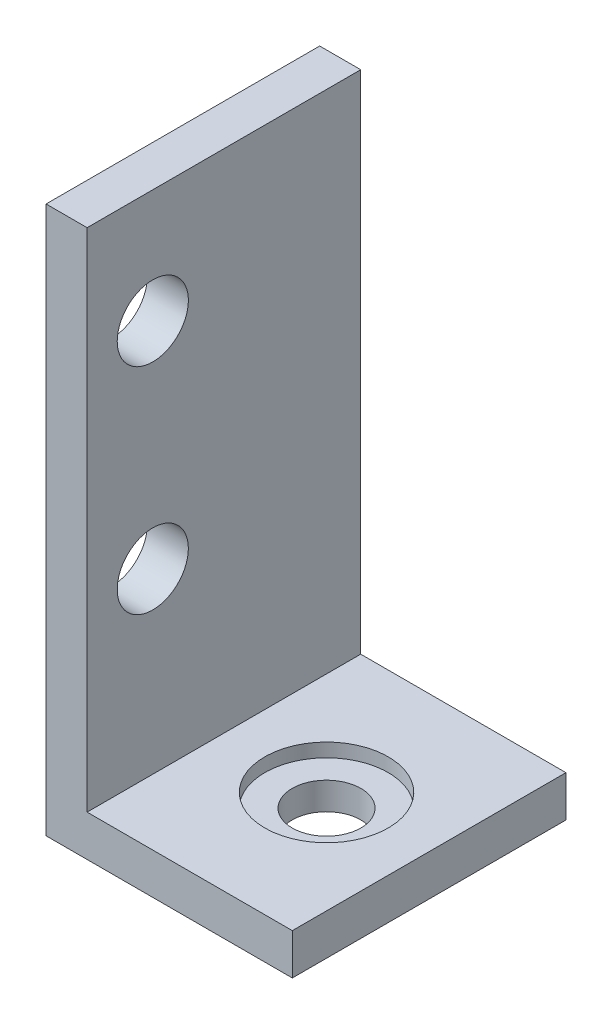
ISO-10303-21;
HEADER;
FILE_DESCRIPTION(('STEP AP214'),'2;1');
FILE_NAME('part.step','',(''),(''),'','','');
FILE_SCHEMA(('AUTOMOTIVE_DESIGN { 1 0 10303 214 1 1 1 1 }'));
ENDSEC;
DATA;
#1=APPLICATION_CONTEXT('core data for automotive mechanical design processes');
#2=APPLICATION_PROTOCOL_DEFINITION('international standard','automotive_design',2000,#1);
#3=PRODUCT_CONTEXT('',#1,'mechanical');
#4=PRODUCT('Part','Part','',(#3));
#5=PRODUCT_RELATED_PRODUCT_CATEGORY('part','',(#4));
#6=PRODUCT_DEFINITION_FORMATION('','',#4);
#7=PRODUCT_DEFINITION_CONTEXT('part definition',#1,'design');
#8=PRODUCT_DEFINITION('design','',#6,#7);
#9=PRODUCT_DEFINITION_SHAPE('','',#8);
#10=(LENGTH_UNIT() NAMED_UNIT(*) SI_UNIT(.MILLI.,.METRE.));
#11=(NAMED_UNIT(*) PLANE_ANGLE_UNIT() SI_UNIT($,.RADIAN.));
#12=(NAMED_UNIT(*) SI_UNIT($,.STERADIAN.) SOLID_ANGLE_UNIT());
#13=UNCERTAINTY_MEASURE_WITH_UNIT(LENGTH_MEASURE(1.E-05),#10,'distance_accuracy_value','');
#14=(GEOMETRIC_REPRESENTATION_CONTEXT(3) GLOBAL_UNCERTAINTY_ASSIGNED_CONTEXT((#13)) GLOBAL_UNIT_ASSIGNED_CONTEXT((#10,
#11,#12)) REPRESENTATION_CONTEXT('',''));
#15=CARTESIAN_POINT('',(0.,0.,0.));
#16=DIRECTION('',(0.,0.,1.));
#17=DIRECTION('',(1.,0.,0.));
#18=AXIS2_PLACEMENT_3D('',#15,#16,#17);
#19=CARTESIAN_POINT('',(30.6258807045637,3.,-9.11509707766213));
#20=DIRECTION('',(0.,0.,-1.));
#21=DIRECTION('',(-1.,0.,0.));
#22=AXIS2_PLACEMENT_3D('',#19,#20,#21);
#23=PLANE('',#22);
#24=DIRECTION('',(0.,1.,0.));
#25=VECTOR('',#24,1.);
#26=CARTESIAN_POINT('',(15.6258807045637,0.,-9.11509707766213));
#27=LINE('',#26,#25);
#28=CARTESIAN_POINT('',(15.6258807045637,3.,-9.11509707766213));
#29=VERTEX_POINT('',#28);
#30=CARTESIAN_POINT('',(15.6258807045636,40.,-9.11509707766213));
#31=VERTEX_POINT('',#30);
#32=EDGE_CURVE('E50',#29,#31,#27,.T.);
#33=ORIENTED_EDGE('',*,*,#32,.T.);
#34=DIRECTION('',(-1.,0.,0.));
#35=VECTOR('',#34,1.);
#36=CARTESIAN_POINT('',(15.6258807045636,40.,-9.11509707766213));
#37=LINE('',#36,#35);
#38=CARTESIAN_POINT('',(12.6258807045636,40.,-9.11509707766213));
#39=VERTEX_POINT('',#38);
#40=EDGE_CURVE('E127',#31,#39,#37,.T.);
#41=ORIENTED_EDGE('',*,*,#40,.T.);
#42=DIRECTION('',(0.,1.,0.));
#43=VECTOR('',#42,1.);
#44=CARTESIAN_POINT('',(12.6258807045636,0.,-9.11509707766213));
#45=LINE('',#44,#43);
#46=CARTESIAN_POINT('',(12.6258807045636,0.,-9.11509707766213));
#47=VERTEX_POINT('',#46);
#48=EDGE_CURVE('E96',#47,#39,#45,.T.);
#49=ORIENTED_EDGE('',*,*,#48,.F.);
#50=DIRECTION('',(1.,0.,0.));
#51=VECTOR('',#50,1.);
#52=CARTESIAN_POINT('',(30.6258807045637,0.,-9.11509707766213));
#53=LINE('',#52,#51);
#54=CARTESIAN_POINT('',(30.6258807045637,0.,-9.11509707766213));
#55=VERTEX_POINT('',#54);
#56=EDGE_CURVE('E93',#47,#55,#53,.T.);
#57=ORIENTED_EDGE('',*,*,#56,.T.);
#58=DIRECTION('',(0.,-1.,0.));
#59=VECTOR('',#58,1.);
#60=CARTESIAN_POINT('',(30.6258807045637,3.,-9.11509707766213));
#61=LINE('',#60,#59);
#62=CARTESIAN_POINT('',(30.6258807045637,3.,-9.11509707766213));
#63=VERTEX_POINT('',#62);
#64=EDGE_CURVE('E11',#63,#55,#61,.T.);
#65=ORIENTED_EDGE('',*,*,#64,.F.);
#66=DIRECTION('',(1.,0.,0.));
#67=VECTOR('',#66,1.);
#68=CARTESIAN_POINT('',(30.6258807045637,3.,-9.11509707766213));
#69=LINE('',#68,#67);
#70=EDGE_CURVE('E85',#29,#63,#69,.T.);
#71=ORIENTED_EDGE('',*,*,#70,.F.);
#72=EDGE_LOOP('',(#33,#41,#49,#57,#65,#71));
#73=FACE_BOUND('',#72,.T.);
#74=ADVANCED_FACE('F33',(#73),#23,.F.);
#75=CARTESIAN_POINT('',(15.6258807045636,3.,-29.1150970776621));
#76=DIRECTION('',(0.,0.,1.));
#77=DIRECTION('',(1.,0.,0.));
#78=AXIS2_PLACEMENT_3D('',#75,#76,#77);
#79=PLANE('',#78);
#80=DIRECTION('',(0.,1.,0.));
#81=VECTOR('',#80,1.);
#82=CARTESIAN_POINT('',(12.6258807045636,0.,-29.1150970776621));
#83=LINE('',#82,#81);
#84=CARTESIAN_POINT('',(12.6258807045636,0.,-29.1150970776621));
#85=VERTEX_POINT('',#84);
#86=CARTESIAN_POINT('',(12.6258807045636,40.,-29.1150970776622));
#87=VERTEX_POINT('',#86);
#88=EDGE_CURVE('E118',#85,#87,#83,.T.);
#89=ORIENTED_EDGE('',*,*,#88,.T.);
#90=DIRECTION('',(-1.,0.,0.));
#91=VECTOR('',#90,1.);
#92=CARTESIAN_POINT('',(15.6258807045636,40.,-29.1150970776622));
#93=LINE('',#92,#91);
#94=CARTESIAN_POINT('',(15.6258807045636,40.,-29.1150970776622));
#95=VERTEX_POINT('',#94);
#96=EDGE_CURVE('E126',#95,#87,#93,.T.);
#97=ORIENTED_EDGE('',*,*,#96,.F.);
#98=DIRECTION('',(0.,1.,0.));
#99=VECTOR('',#98,1.);
#100=CARTESIAN_POINT('',(15.6258807045636,0.,-29.1150970776621));
#101=LINE('',#100,#99);
#102=CARTESIAN_POINT('',(15.6258807045636,3.,-29.1150970776621));
#103=VERTEX_POINT('',#102);
#104=EDGE_CURVE('E115',#103,#95,#101,.T.);
#105=ORIENTED_EDGE('',*,*,#104,.F.);
#106=DIRECTION('',(-1.,0.,0.));
#107=VECTOR('',#106,1.);
#108=CARTESIAN_POINT('',(15.6258807045636,3.,-29.1150970776621));
#109=LINE('',#108,#107);
#110=CARTESIAN_POINT('',(30.6258807045637,3.,-29.1150970776621));
#111=VERTEX_POINT('',#110);
#112=EDGE_CURVE('E84',#111,#103,#109,.T.);
#113=ORIENTED_EDGE('',*,*,#112,.F.);
#114=DIRECTION('',(0.,-1.,0.));
#115=VECTOR('',#114,1.);
#116=CARTESIAN_POINT('',(30.6258807045637,3.,-29.1150970776621));
#117=LINE('',#116,#115);
#118=CARTESIAN_POINT('',(30.6258807045637,0.,-29.1150970776621));
#119=VERTEX_POINT('',#118);
#120=EDGE_CURVE('E42',#111,#119,#117,.T.);
#121=ORIENTED_EDGE('',*,*,#120,.T.);
#122=DIRECTION('',(-1.,0.,0.));
#123=VECTOR('',#122,1.);
#124=CARTESIAN_POINT('',(15.6258807045636,0.,-29.1150970776621));
#125=LINE('',#124,#123);
#126=EDGE_CURVE('E90',#119,#85,#125,.T.);
#127=ORIENTED_EDGE('',*,*,#126,.T.);
#128=EDGE_LOOP('',(#89,#97,#105,#113,#121,#127));
#129=FACE_BOUND('',#128,.T.);
#130=ADVANCED_FACE('F179',(#129),#79,.F.);
#131=CARTESIAN_POINT('',(15.6258807045636,0.,-29.1150970776621));
#132=DIRECTION('',(1.,0.,0.));
#133=DIRECTION('',(0.,0.,-1.));
#134=AXIS2_PLACEMENT_3D('',#131,#132,#133);
#135=PLANE('',#134);
#136=CARTESIAN_POINT('',(15.6258807045636,31.7,-13.9150970776621));
#137=DIRECTION('',(-1.,0.,0.));
#138=DIRECTION('',(0.,0.,1.));
#139=AXIS2_PLACEMENT_3D('',#136,#137,#138);
#140=CIRCLE('',#139,2.6);
#141=CARTESIAN_POINT('',(15.6258807045636,31.7,-11.3150970776621));
#142=VERTEX_POINT('',#141);
#143=EDGE_CURVE('E141',#142,#142,#140,.T.);
#144=ORIENTED_EDGE('',*,*,#143,.T.);
#145=EDGE_LOOP('',(#144));
#146=FACE_BOUND('',#145,.T.);
#147=CARTESIAN_POINT('',(15.6258807045636,16.,-13.9150970776621));
#148=DIRECTION('',(1.,0.,0.));
#149=DIRECTION('',(0.,0.,-1.));
#150=AXIS2_PLACEMENT_3D('',#147,#148,#149);
#151=CIRCLE('',#150,2.6);
#152=CARTESIAN_POINT('',(15.6258807045636,16.,-16.5150970776621));
#153=VERTEX_POINT('',#152);
#154=EDGE_CURVE('E138',#153,#153,#151,.T.);
#155=ORIENTED_EDGE('',*,*,#154,.F.);
#156=EDGE_LOOP('',(#155));
#157=FACE_BOUND('',#156,.T.);
#158=ORIENTED_EDGE('',*,*,#104,.T.);
#159=DIRECTION('',(0.,0.,-1.));
#160=VECTOR('',#159,1.);
#161=CARTESIAN_POINT('',(15.6258807045636,40.,-29.1150970776622));
#162=LINE('',#161,#160);
#163=EDGE_CURVE('E129',#31,#95,#162,.T.);
#164=ORIENTED_EDGE('',*,*,#163,.F.);
#165=ORIENTED_EDGE('',*,*,#32,.F.);
#166=DIRECTION('',(0.,0.,1.));
#167=VECTOR('',#166,1.);
#168=CARTESIAN_POINT('',(15.6258807045637,3.,-9.11509707766213));
#169=LINE('',#168,#167);
#170=EDGE_CURVE('E67',#103,#29,#169,.T.);
#171=ORIENTED_EDGE('',*,*,#170,.F.);
#172=EDGE_LOOP('',(#158,#164,#165,#171));
#173=FACE_BOUND('',#172,.T.);
#174=ADVANCED_FACE('F150',(#146,#157,#173),#135,.T.);
#175=CARTESIAN_POINT('',(12.6258807045636,0.,-29.1150970776621));
#176=DIRECTION('',(-1.,0.,0.));
#177=DIRECTION('',(0.,0.,1.));
#178=AXIS2_PLACEMENT_3D('',#175,#176,#177);
#179=PLANE('',#178);
#180=CARTESIAN_POINT('',(12.6258807045636,31.7,-13.9150970776621));
#181=DIRECTION('',(-1.,0.,0.));
#182=DIRECTION('',(0.,0.,1.));
#183=AXIS2_PLACEMENT_3D('',#180,#181,#182);
#184=CIRCLE('',#183,2.6);
#185=CARTESIAN_POINT('',(12.6258807045636,31.7,-11.3150970776621));
#186=VERTEX_POINT('',#185);
#187=EDGE_CURVE('E144',#186,#186,#184,.T.);
#188=ORIENTED_EDGE('',*,*,#187,.F.);
#189=EDGE_LOOP('',(#188));
#190=FACE_BOUND('',#189,.T.);
#191=CARTESIAN_POINT('',(12.6258807045636,16.,-13.9150970776621));
#192=DIRECTION('',(1.,0.,0.));
#193=DIRECTION('',(0.,0.,-1.));
#194=AXIS2_PLACEMENT_3D('',#191,#192,#193);
#195=CIRCLE('',#194,2.6);
#196=CARTESIAN_POINT('',(12.6258807045636,16.,-16.5150970776621));
#197=VERTEX_POINT('',#196);
#198=EDGE_CURVE('E135',#197,#197,#195,.T.);
#199=ORIENTED_EDGE('',*,*,#198,.T.);
#200=EDGE_LOOP('',(#199));
#201=FACE_BOUND('',#200,.T.);
#202=ORIENTED_EDGE('',*,*,#48,.T.);
#203=DIRECTION('',(0.,0.,-1.));
#204=VECTOR('',#203,1.);
#205=CARTESIAN_POINT('',(12.6258807045636,40.,-29.1150970776622));
#206=LINE('',#205,#204);
#207=EDGE_CURVE('E132',#39,#87,#206,.T.);
#208=ORIENTED_EDGE('',*,*,#207,.T.);
#209=ORIENTED_EDGE('',*,*,#88,.F.);
#210=DIRECTION('',(0.,0.,1.));
#211=VECTOR('',#210,1.);
#212=CARTESIAN_POINT('',(12.6258807045636,0.,-29.1150970776621));
#213=LINE('',#212,#211);
#214=EDGE_CURVE('E121',#85,#47,#213,.T.);
#215=ORIENTED_EDGE('',*,*,#214,.T.);
#216=EDGE_LOOP('',(#202,#208,#209,#215));
#217=FACE_BOUND('',#216,.T.);
#218=ADVANCED_FACE('F160',(#190,#201,#217),#179,.T.);
#219=CARTESIAN_POINT('',(23.1258807045636,3.,-19.1150970776621));
#220=DIRECTION('',(0.,-1.,0.));
#221=DIRECTION('',(0.,0.,-1.));
#222=AXIS2_PLACEMENT_3D('',#219,#220,#221);
#223=CYLINDRICAL_SURFACE('',#222,2.51);
#224=CARTESIAN_POINT('',(23.1258807045636,0.,-19.1150970776621));
#225=DIRECTION('',(0.,1.,0.));
#226=DIRECTION('',(0.,0.,1.));
#227=AXIS2_PLACEMENT_3D('',#224,#225,#226);
#228=CIRCLE('',#227,2.51);
#229=CARTESIAN_POINT('',(23.1258807045636,0.,-16.6050970776621));
#230=VERTEX_POINT('',#229);
#231=EDGE_CURVE('E99',#230,#230,#228,.T.);
#232=ORIENTED_EDGE('',*,*,#231,.F.);
#233=EDGE_LOOP('',(#232));
#234=FACE_BOUND('',#233,.T.);
#235=CARTESIAN_POINT('',(23.1258807045636,2.,-19.1150970776621));
#236=DIRECTION('',(0.,1.,0.));
#237=DIRECTION('',(0.,0.,1.));
#238=AXIS2_PLACEMENT_3D('',#235,#236,#237);
#239=CIRCLE('',#238,2.51);
#240=CARTESIAN_POINT('',(23.1258807045636,2.,-16.6050970776621));
#241=VERTEX_POINT('',#240);
#242=EDGE_CURVE('E36',#241,#241,#239,.T.);
#243=ORIENTED_EDGE('',*,*,#242,.T.);
#244=EDGE_LOOP('',(#243));
#245=FACE_BOUND('',#244,.T.);
#246=ADVANCED_FACE('F163',(#234,#245),#223,.F.);
#247=CARTESIAN_POINT('',(0.,3.,0.));
#248=DIRECTION('',(0.,-1.,0.));
#249=DIRECTION('',(0.,0.,-1.));
#250=AXIS2_PLACEMENT_3D('',#247,#248,#249);
#251=PLANE('',#250);
#252=CARTESIAN_POINT('',(23.1258807045636,3.,-19.1150970776621));
#253=DIRECTION('',(0.,1.,0.));
#254=DIRECTION('',(0.,0.,1.));
#255=AXIS2_PLACEMENT_3D('',#252,#253,#254);
#256=CIRCLE('',#255,4.51);
#257=CARTESIAN_POINT('',(23.1258807045636,3.,-14.6050970776621));
#258=VERTEX_POINT('',#257);
#259=EDGE_CURVE('E111',#258,#258,#256,.T.);
#260=ORIENTED_EDGE('',*,*,#259,.F.);
#261=EDGE_LOOP('',(#260));
#262=FACE_BOUND('',#261,.T.);
#263=ORIENTED_EDGE('',*,*,#70,.T.);
#264=DIRECTION('',(0.,0.,-1.));
#265=VECTOR('',#264,1.);
#266=CARTESIAN_POINT('',(30.6258807045637,3.,-9.11509707766213));
#267=LINE('',#266,#265);
#268=EDGE_CURVE('E75',#63,#111,#267,.T.);
#269=ORIENTED_EDGE('',*,*,#268,.T.);
#270=ORIENTED_EDGE('',*,*,#112,.T.);
#271=ORIENTED_EDGE('',*,*,#170,.T.);
#272=EDGE_LOOP('',(#263,#269,#270,#271));
#273=FACE_BOUND('',#272,.T.);
#274=ADVANCED_FACE('F88',(#262,#273),#251,.F.);
#275=CARTESIAN_POINT('',(0.,0.,0.));
#276=DIRECTION('',(0.,-1.,0.));
#277=DIRECTION('',(0.,0.,-1.));
#278=AXIS2_PLACEMENT_3D('',#275,#276,#277);
#279=PLANE('',#278);
#280=ORIENTED_EDGE('',*,*,#56,.F.);
#281=ORIENTED_EDGE('',*,*,#214,.F.);
#282=ORIENTED_EDGE('',*,*,#126,.F.);
#283=DIRECTION('',(0.,0.,-1.));
#284=VECTOR('',#283,1.);
#285=CARTESIAN_POINT('',(30.6258807045637,0.,-9.11509707766213));
#286=LINE('',#285,#284);
#287=EDGE_CURVE('E63',#55,#119,#286,.T.);
#288=ORIENTED_EDGE('',*,*,#287,.F.);
#289=EDGE_LOOP('',(#280,#281,#282,#288));
#290=FACE_BOUND('',#289,.T.);
#291=ORIENTED_EDGE('',*,*,#231,.T.);
#292=EDGE_LOOP('',(#291));
#293=FACE_BOUND('',#292,.T.);
#294=ADVANCED_FACE('F182',(#290,#293),#279,.T.);
#295=CARTESIAN_POINT('',(30.6258807045637,3.,-9.11509707766213));
#296=DIRECTION('',(-1.,0.,0.));
#297=DIRECTION('',(0.,0.,1.));
#298=AXIS2_PLACEMENT_3D('',#295,#296,#297);
#299=PLANE('',#298);
#300=ORIENTED_EDGE('',*,*,#287,.T.);
#301=ORIENTED_EDGE('',*,*,#120,.F.);
#302=ORIENTED_EDGE('',*,*,#268,.F.);
#303=ORIENTED_EDGE('',*,*,#64,.T.);
#304=EDGE_LOOP('',(#300,#301,#302,#303));
#305=FACE_BOUND('',#304,.T.);
#306=ADVANCED_FACE('F77',(#305),#299,.F.);
#307=CARTESIAN_POINT('',(23.1258807045636,2.,-19.1150970776621));
#308=DIRECTION('',(0.,1.,0.));
#309=DIRECTION('',(0.,0.,1.));
#310=AXIS2_PLACEMENT_3D('',#307,#308,#309);
#311=CYLINDRICAL_SURFACE('',#310,4.51);
#312=CARTESIAN_POINT('',(23.1258807045636,2.,-19.1150970776621));
#313=DIRECTION('',(0.,1.,0.));
#314=DIRECTION('',(0.,0.,1.));
#315=AXIS2_PLACEMENT_3D('',#312,#313,#314);
#316=CIRCLE('',#315,4.51);
#317=CARTESIAN_POINT('',(23.1258807045636,2.,-14.6050970776621));
#318=VERTEX_POINT('',#317);
#319=EDGE_CURVE('E114',#318,#318,#316,.T.);
#320=ORIENTED_EDGE('',*,*,#319,.F.);
#321=EDGE_LOOP('',(#320));
#322=FACE_BOUND('',#321,.T.);
#323=ORIENTED_EDGE('',*,*,#259,.T.);
#324=EDGE_LOOP('',(#323));
#325=FACE_BOUND('',#324,.T.);
#326=ADVANCED_FACE('F197',(#322,#325),#311,.F.);
#327=CARTESIAN_POINT('',(23.1258807045636,2.,-19.1150970776621));
#328=DIRECTION('',(0.,1.,0.));
#329=DIRECTION('',(0.,0.,1.));
#330=AXIS2_PLACEMENT_3D('',#327,#328,#329);
#331=PLANE('',#330);
#332=ORIENTED_EDGE('',*,*,#242,.F.);
#333=EDGE_LOOP('',(#332));
#334=FACE_BOUND('',#333,.T.);
#335=ORIENTED_EDGE('',*,*,#319,.T.);
#336=EDGE_LOOP('',(#335));
#337=FACE_BOUND('',#336,.T.);
#338=ADVANCED_FACE('F194',(#334,#337),#331,.T.);
#339=CARTESIAN_POINT('',(15.6258807045636,40.,-29.1150970776622));
#340=DIRECTION('',(0.,1.,0.));
#341=DIRECTION('',(0.,0.,1.));
#342=AXIS2_PLACEMENT_3D('',#339,#340,#341);
#343=PLANE('',#342);
#344=ORIENTED_EDGE('',*,*,#207,.F.);
#345=ORIENTED_EDGE('',*,*,#40,.F.);
#346=ORIENTED_EDGE('',*,*,#163,.T.);
#347=ORIENTED_EDGE('',*,*,#96,.T.);
#348=EDGE_LOOP('',(#344,#345,#346,#347));
#349=FACE_BOUND('',#348,.T.);
#350=ADVANCED_FACE('F175',(#349),#343,.T.);
#351=CARTESIAN_POINT('',(12.6258807045636,16.,-13.9150970776621));
#352=DIRECTION('',(1.,0.,0.));
#353=DIRECTION('',(0.,0.,-1.));
#354=AXIS2_PLACEMENT_3D('',#351,#352,#353);
#355=CYLINDRICAL_SURFACE('',#354,2.6);
#356=ORIENTED_EDGE('',*,*,#198,.F.);
#357=EDGE_LOOP('',(#356));
#358=FACE_BOUND('',#357,.T.);
#359=ORIENTED_EDGE('',*,*,#154,.T.);
#360=EDGE_LOOP('',(#359));
#361=FACE_BOUND('',#360,.T.);
#362=ADVANCED_FACE('F156',(#358,#361),#355,.F.);
#363=CARTESIAN_POINT('',(15.6258807045636,31.7,-13.9150970776621));
#364=DIRECTION('',(-1.,0.,0.));
#365=DIRECTION('',(0.,0.,1.));
#366=AXIS2_PLACEMENT_3D('',#363,#364,#365);
#367=CYLINDRICAL_SURFACE('',#366,2.6);
#368=ORIENTED_EDGE('',*,*,#143,.F.);
#369=EDGE_LOOP('',(#368));
#370=FACE_BOUND('',#369,.T.);
#371=ORIENTED_EDGE('',*,*,#187,.T.);
#372=EDGE_LOOP('',(#371));
#373=FACE_BOUND('',#372,.T.);
#374=ADVANCED_FACE('F153',(#370,#373),#367,.F.);
#375=CLOSED_SHELL('',(#74,#130,#174,#218,#246,#274,#294,#306,#326,#338,#350,#362,#374));
#376=MANIFOLD_SOLID_BREP('B2',#375);
#377=ADVANCED_BREP_SHAPE_REPRESENTATION('',(#18,#376),#14);
#378=SHAPE_DEFINITION_REPRESENTATION(#9,#377);
ENDSEC;
END-ISO-10303-21;
